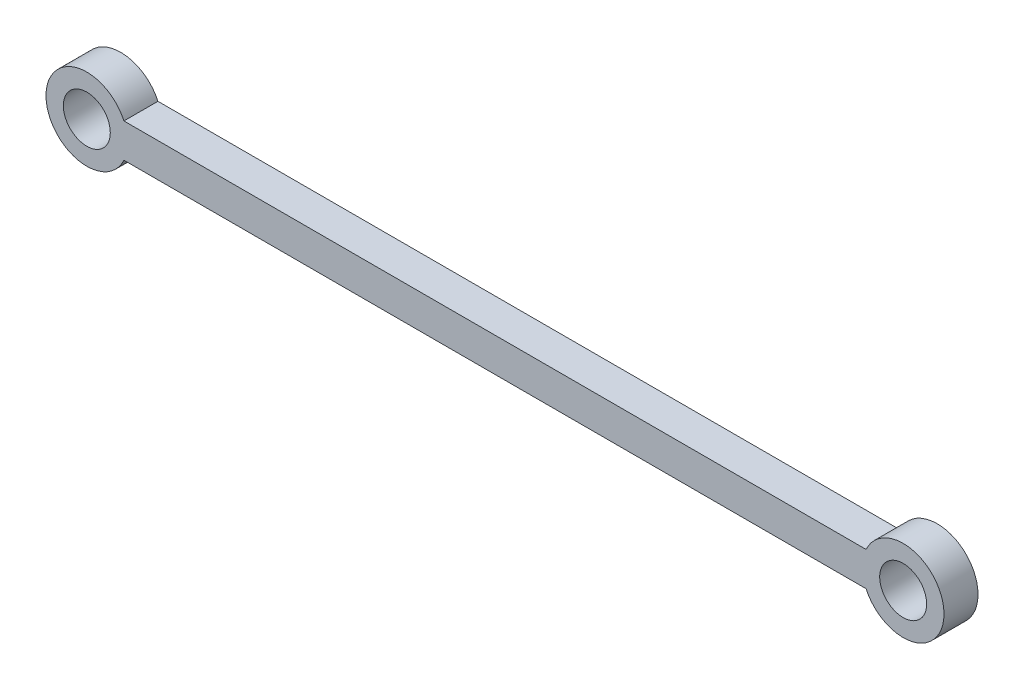
ISO-10303-21;
HEADER;
FILE_DESCRIPTION(('STEP AP214'),'2;1');
FILE_NAME('part.step','',(''),(''),'','','');
FILE_SCHEMA(('AUTOMOTIVE_DESIGN { 1 0 10303 214 1 1 1 1 }'));
ENDSEC;
DATA;
#1=APPLICATION_CONTEXT('core data for automotive mechanical design processes');
#2=APPLICATION_PROTOCOL_DEFINITION('international standard','automotive_design',2000,#1);
#3=PRODUCT_CONTEXT('',#1,'mechanical');
#4=PRODUCT('Part','Part','',(#3));
#5=PRODUCT_RELATED_PRODUCT_CATEGORY('part','',(#4));
#6=PRODUCT_DEFINITION_FORMATION('','',#4);
#7=PRODUCT_DEFINITION_CONTEXT('part definition',#1,'design');
#8=PRODUCT_DEFINITION('design','',#6,#7);
#9=PRODUCT_DEFINITION_SHAPE('','',#8);
#10=(LENGTH_UNIT() NAMED_UNIT(*) SI_UNIT(.MILLI.,.METRE.));
#11=(NAMED_UNIT(*) PLANE_ANGLE_UNIT() SI_UNIT($,.RADIAN.));
#12=(NAMED_UNIT(*) SI_UNIT($,.STERADIAN.) SOLID_ANGLE_UNIT());
#13=UNCERTAINTY_MEASURE_WITH_UNIT(LENGTH_MEASURE(1.E-05),#10,'distance_accuracy_value','');
#14=(GEOMETRIC_REPRESENTATION_CONTEXT(3) GLOBAL_UNCERTAINTY_ASSIGNED_CONTEXT((#13)) GLOBAL_UNIT_ASSIGNED_CONTEXT((#10,
#11,#12)) REPRESENTATION_CONTEXT('',''));
#15=CARTESIAN_POINT('',(0.,0.,0.));
#16=DIRECTION('',(0.,0.,1.));
#17=DIRECTION('',(1.,0.,0.));
#18=AXIS2_PLACEMENT_3D('',#15,#16,#17);
#19=CARTESIAN_POINT('',(-120.,0.,-5.));
#20=DIRECTION('',(0.,0.,1.));
#21=DIRECTION('',(1.,0.,0.));
#22=AXIS2_PLACEMENT_3D('',#19,#20,#21);
#23=CYLINDRICAL_SURFACE('',#22,6.);
#24=CARTESIAN_POINT('',(-120.,0.,0.));
#25=DIRECTION('',(0.,0.,1.));
#26=DIRECTION('',(1.,0.,0.));
#27=AXIS2_PLACEMENT_3D('',#24,#25,#26);
#28=CIRCLE('',#27,6.);
#29=CARTESIAN_POINT('',(-114.545643942682,2.5,0.));
#30=VERTEX_POINT('',#29);
#31=CARTESIAN_POINT('',(-114.545643942682,-2.5,0.));
#32=VERTEX_POINT('',#31);
#33=EDGE_CURVE('E102',#30,#32,#28,.T.);
#34=ORIENTED_EDGE('',*,*,#33,.F.);
#35=DIRECTION('',(0.,0.,1.));
#36=VECTOR('',#35,1.);
#37=CARTESIAN_POINT('',(-114.545643942682,2.5,-5.));
#38=LINE('',#37,#36);
#39=CARTESIAN_POINT('',(-114.545643942682,2.5,-5.));
#40=VERTEX_POINT('',#39);
#41=EDGE_CURVE('E11',#40,#30,#38,.T.);
#42=ORIENTED_EDGE('',*,*,#41,.F.);
#43=CARTESIAN_POINT('',(-120.,0.,-5.));
#44=DIRECTION('',(0.,0.,1.));
#45=DIRECTION('',(1.,0.,0.));
#46=AXIS2_PLACEMENT_3D('',#43,#44,#45);
#47=CIRCLE('',#46,6.);
#48=CARTESIAN_POINT('',(-114.545643942682,-2.5,-5.));
#49=VERTEX_POINT('',#48);
#50=EDGE_CURVE('E95',#40,#49,#47,.T.);
#51=ORIENTED_EDGE('',*,*,#50,.T.);
#52=DIRECTION('',(0.,0.,1.));
#53=VECTOR('',#52,1.);
#54=CARTESIAN_POINT('',(-114.545643942682,-2.5,-5.));
#55=LINE('',#54,#53);
#56=EDGE_CURVE('E40',#49,#32,#55,.T.);
#57=ORIENTED_EDGE('',*,*,#56,.T.);
#58=EDGE_LOOP('',(#34,#42,#51,#57));
#59=FACE_BOUND('',#58,.T.);
#60=ADVANCED_FACE('F37',(#59),#23,.T.);
#61=CARTESIAN_POINT('',(-114.545643942682,2.5,-5.));
#62=DIRECTION('',(0.,1.,0.));
#63=DIRECTION('',(-1.,0.,0.));
#64=AXIS2_PLACEMENT_3D('',#61,#62,#63);
#65=PLANE('',#64);
#66=DIRECTION('',(-1.,0.,0.));
#67=VECTOR('',#66,1.);
#68=CARTESIAN_POINT('',(-114.545643942682,2.5,0.));
#69=LINE('',#68,#67);
#70=CARTESIAN_POINT('',(-5.45435605731786,2.5,0.));
#71=VERTEX_POINT('',#70);
#72=EDGE_CURVE('E97',#71,#30,#69,.T.);
#73=ORIENTED_EDGE('',*,*,#72,.F.);
#74=DIRECTION('',(0.,0.,1.));
#75=VECTOR('',#74,1.);
#76=CARTESIAN_POINT('',(-5.45435605731786,2.5,-5.));
#77=LINE('',#76,#75);
#78=CARTESIAN_POINT('',(-5.45435605731786,2.5,-5.));
#79=VERTEX_POINT('',#78);
#80=EDGE_CURVE('E46',#79,#71,#77,.T.);
#81=ORIENTED_EDGE('',*,*,#80,.F.);
#82=DIRECTION('',(-1.,0.,0.));
#83=VECTOR('',#82,1.);
#84=CARTESIAN_POINT('',(-114.545643942682,2.5,-5.));
#85=LINE('',#84,#83);
#86=EDGE_CURVE('E92',#79,#40,#85,.T.);
#87=ORIENTED_EDGE('',*,*,#86,.T.);
#88=ORIENTED_EDGE('',*,*,#41,.T.);
#89=EDGE_LOOP('',(#73,#81,#87,#88));
#90=FACE_BOUND('',#89,.T.);
#91=ADVANCED_FACE('F113',(#90),#65,.T.);
#92=CARTESIAN_POINT('',(0.,0.,-5.));
#93=DIRECTION('',(0.,0.,1.));
#94=DIRECTION('',(1.,0.,0.));
#95=AXIS2_PLACEMENT_3D('',#92,#93,#94);
#96=CYLINDRICAL_SURFACE('',#95,6.);
#97=CARTESIAN_POINT('',(0.,0.,0.));
#98=DIRECTION('',(0.,0.,1.));
#99=DIRECTION('',(1.,0.,0.));
#100=AXIS2_PLACEMENT_3D('',#97,#98,#99);
#101=CIRCLE('',#100,6.);
#102=CARTESIAN_POINT('',(-5.45435605731786,-2.5,0.));
#103=VERTEX_POINT('',#102);
#104=EDGE_CURVE('E87',#103,#71,#101,.T.);
#105=ORIENTED_EDGE('',*,*,#104,.F.);
#106=DIRECTION('',(0.,0.,1.));
#107=VECTOR('',#106,1.);
#108=CARTESIAN_POINT('',(-5.45435605731786,-2.5,-5.));
#109=LINE('',#108,#107);
#110=CARTESIAN_POINT('',(-5.45435605731786,-2.5,-5.));
#111=VERTEX_POINT('',#110);
#112=EDGE_CURVE('E82',#111,#103,#109,.T.);
#113=ORIENTED_EDGE('',*,*,#112,.F.);
#114=CARTESIAN_POINT('',(0.,0.,-5.));
#115=DIRECTION('',(0.,0.,1.));
#116=DIRECTION('',(1.,0.,0.));
#117=AXIS2_PLACEMENT_3D('',#114,#115,#116);
#118=CIRCLE('',#117,6.);
#119=EDGE_CURVE('E85',#111,#79,#118,.T.);
#120=ORIENTED_EDGE('',*,*,#119,.T.);
#121=ORIENTED_EDGE('',*,*,#80,.T.);
#122=EDGE_LOOP('',(#105,#113,#120,#121));
#123=FACE_BOUND('',#122,.T.);
#124=ADVANCED_FACE('F84',(#123),#96,.T.);
#125=CARTESIAN_POINT('',(-114.545643942682,-2.5,-5.));
#126=DIRECTION('',(0.,-1.,0.));
#127=DIRECTION('',(1.,0.,0.));
#128=AXIS2_PLACEMENT_3D('',#125,#126,#127);
#129=PLANE('',#128);
#130=DIRECTION('',(1.,0.,0.));
#131=VECTOR('',#130,1.);
#132=CARTESIAN_POINT('',(-114.545643942682,-2.5,0.));
#133=LINE('',#132,#131);
#134=EDGE_CURVE('E105',#32,#103,#133,.T.);
#135=ORIENTED_EDGE('',*,*,#134,.F.);
#136=ORIENTED_EDGE('',*,*,#56,.F.);
#137=DIRECTION('',(1.,0.,0.));
#138=VECTOR('',#137,1.);
#139=CARTESIAN_POINT('',(-114.545643942682,-2.5,-5.));
#140=LINE('',#139,#138);
#141=EDGE_CURVE('E91',#49,#111,#140,.T.);
#142=ORIENTED_EDGE('',*,*,#141,.T.);
#143=ORIENTED_EDGE('',*,*,#112,.T.);
#144=EDGE_LOOP('',(#135,#136,#142,#143));
#145=FACE_BOUND('',#144,.T.);
#146=ADVANCED_FACE('F94',(#145),#129,.T.);
#147=CARTESIAN_POINT('',(-120.,0.,-5.));
#148=DIRECTION('',(0.,0.,1.));
#149=DIRECTION('',(1.,0.,0.));
#150=AXIS2_PLACEMENT_3D('',#147,#148,#149);
#151=PLANE('',#150);
#152=CARTESIAN_POINT('',(-120.,0.,-5.));
#153=DIRECTION('',(0.,0.,1.));
#154=DIRECTION('',(1.,0.,0.));
#155=AXIS2_PLACEMENT_3D('',#152,#153,#154);
#156=CIRCLE('',#155,3.45);
#157=CARTESIAN_POINT('',(-116.55,0.,-5.));
#158=VERTEX_POINT('',#157);
#159=EDGE_CURVE('E146',#158,#158,#156,.T.);
#160=ORIENTED_EDGE('',*,*,#159,.T.);
#161=EDGE_LOOP('',(#160));
#162=FACE_BOUND('',#161,.T.);
#163=CARTESIAN_POINT('',(0.,0.,-5.));
#164=DIRECTION('',(0.,0.,1.));
#165=DIRECTION('',(1.,0.,0.));
#166=AXIS2_PLACEMENT_3D('',#163,#164,#165);
#167=CIRCLE('',#166,3.45);
#168=CARTESIAN_POINT('',(3.45,0.,-5.));
#169=VERTEX_POINT('',#168);
#170=EDGE_CURVE('E106',#169,#169,#167,.T.);
#171=ORIENTED_EDGE('',*,*,#170,.T.);
#172=EDGE_LOOP('',(#171));
#173=FACE_BOUND('',#172,.T.);
#174=ORIENTED_EDGE('',*,*,#50,.F.);
#175=ORIENTED_EDGE('',*,*,#86,.F.);
#176=ORIENTED_EDGE('',*,*,#119,.F.);
#177=ORIENTED_EDGE('',*,*,#141,.F.);
#178=EDGE_LOOP('',(#174,#175,#176,#177));
#179=FACE_BOUND('',#178,.T.);
#180=ADVANCED_FACE('F90',(#162,#173,#179),#151,.F.);
#181=CARTESIAN_POINT('',(-120.,0.,0.));
#182=DIRECTION('',(0.,0.,1.));
#183=DIRECTION('',(1.,0.,0.));
#184=AXIS2_PLACEMENT_3D('',#181,#182,#183);
#185=PLANE('',#184);
#186=CARTESIAN_POINT('',(-120.,0.,0.));
#187=DIRECTION('',(0.,0.,1.));
#188=DIRECTION('',(1.,0.,0.));
#189=AXIS2_PLACEMENT_3D('',#186,#187,#188);
#190=CIRCLE('',#189,3.45);
#191=CARTESIAN_POINT('',(-116.55,0.,0.));
#192=VERTEX_POINT('',#191);
#193=EDGE_CURVE('E149',#192,#192,#190,.T.);
#194=ORIENTED_EDGE('',*,*,#193,.F.);
#195=EDGE_LOOP('',(#194));
#196=FACE_BOUND('',#195,.T.);
#197=CARTESIAN_POINT('',(0.,0.,0.));
#198=DIRECTION('',(0.,0.,1.));
#199=DIRECTION('',(1.,0.,0.));
#200=AXIS2_PLACEMENT_3D('',#197,#198,#199);
#201=CIRCLE('',#200,3.45);
#202=CARTESIAN_POINT('',(3.45,0.,0.));
#203=VERTEX_POINT('',#202);
#204=EDGE_CURVE('E151',#203,#203,#201,.T.);
#205=ORIENTED_EDGE('',*,*,#204,.F.);
#206=EDGE_LOOP('',(#205));
#207=FACE_BOUND('',#206,.T.);
#208=ORIENTED_EDGE('',*,*,#33,.T.);
#209=ORIENTED_EDGE('',*,*,#134,.T.);
#210=ORIENTED_EDGE('',*,*,#104,.T.);
#211=ORIENTED_EDGE('',*,*,#72,.T.);
#212=EDGE_LOOP('',(#208,#209,#210,#211));
#213=FACE_BOUND('',#212,.T.);
#214=ADVANCED_FACE('F112',(#196,#207,#213),#185,.T.);
#215=CARTESIAN_POINT('',(0.,0.,-5.));
#216=DIRECTION('',(0.,0.,1.));
#217=DIRECTION('',(1.,0.,0.));
#218=AXIS2_PLACEMENT_3D('',#215,#216,#217);
#219=CYLINDRICAL_SURFACE('',#218,3.45);
#220=ORIENTED_EDGE('',*,*,#170,.F.);
#221=EDGE_LOOP('',(#220));
#222=FACE_BOUND('',#221,.T.);
#223=ORIENTED_EDGE('',*,*,#204,.T.);
#224=EDGE_LOOP('',(#223));
#225=FACE_BOUND('',#224,.T.);
#226=ADVANCED_FACE('F131',(#222,#225),#219,.F.);
#227=CARTESIAN_POINT('',(-120.,0.,-5.));
#228=DIRECTION('',(0.,0.,1.));
#229=DIRECTION('',(1.,0.,0.));
#230=AXIS2_PLACEMENT_3D('',#227,#228,#229);
#231=CYLINDRICAL_SURFACE('',#230,3.45);
#232=ORIENTED_EDGE('',*,*,#159,.F.);
#233=EDGE_LOOP('',(#232));
#234=FACE_BOUND('',#233,.T.);
#235=ORIENTED_EDGE('',*,*,#193,.T.);
#236=EDGE_LOOP('',(#235));
#237=FACE_BOUND('',#236,.T.);
#238=ADVANCED_FACE('F138',(#234,#237),#231,.F.);
#239=CLOSED_SHELL('',(#60,#91,#124,#146,#180,#214,#226,#238));
#240=MANIFOLD_SOLID_BREP('B2',#239);
#241=ADVANCED_BREP_SHAPE_REPRESENTATION('',(#18,#240),#14);
#242=SHAPE_DEFINITION_REPRESENTATION(#9,#241);
ENDSEC;
END-ISO-10303-21;
